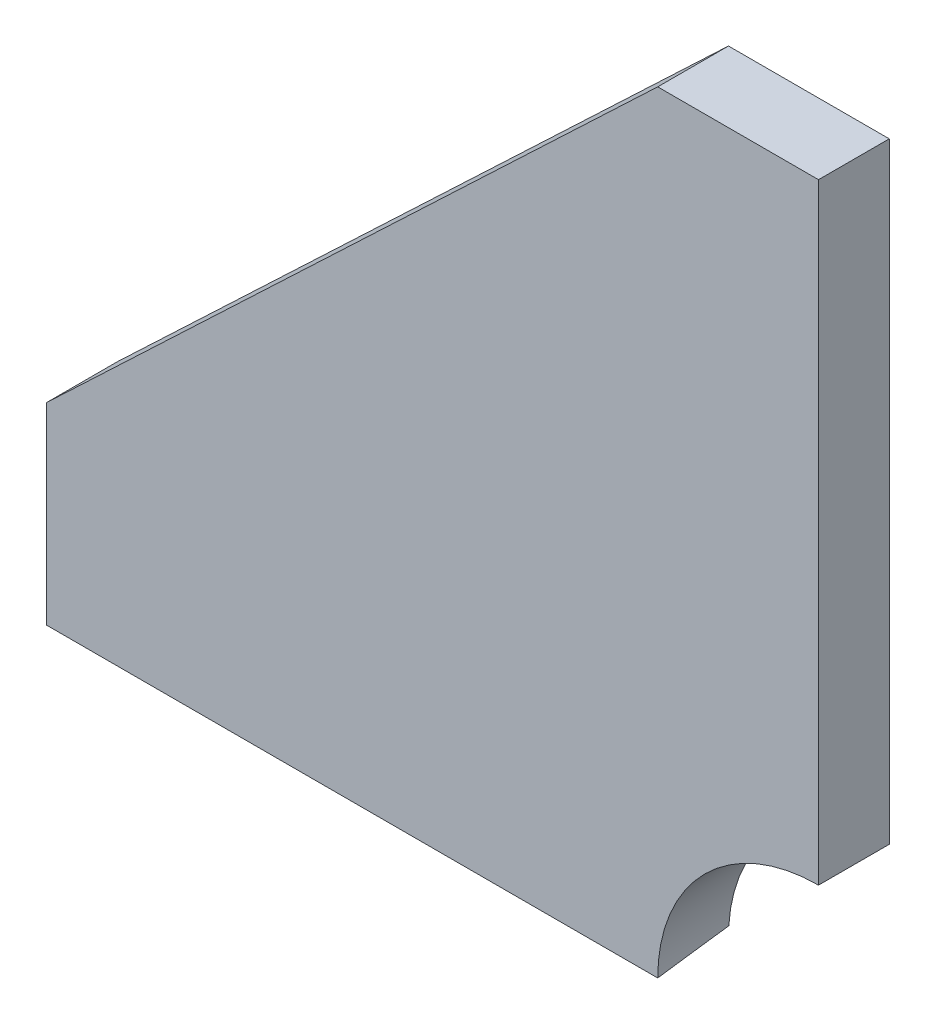
ISO-10303-21;
HEADER;
FILE_DESCRIPTION(('STEP AP214'),'2;1');
FILE_NAME('part.step','',(''),(''),'','','');
FILE_SCHEMA(('AUTOMOTIVE_DESIGN { 1 0 10303 214 1 1 1 1 }'));
ENDSEC;
DATA;
#1=APPLICATION_CONTEXT('core data for automotive mechanical design processes');
#2=APPLICATION_PROTOCOL_DEFINITION('international standard','automotive_design',2000,#1);
#3=PRODUCT_CONTEXT('',#1,'mechanical');
#4=PRODUCT('Part','Part','',(#3));
#5=PRODUCT_RELATED_PRODUCT_CATEGORY('part','',(#4));
#6=PRODUCT_DEFINITION_FORMATION('','',#4);
#7=PRODUCT_DEFINITION_CONTEXT('part definition',#1,'design');
#8=PRODUCT_DEFINITION('design','',#6,#7);
#9=PRODUCT_DEFINITION_SHAPE('','',#8);
#10=(LENGTH_UNIT() NAMED_UNIT(*) SI_UNIT(.MILLI.,.METRE.));
#11=(NAMED_UNIT(*) PLANE_ANGLE_UNIT() SI_UNIT($,.RADIAN.));
#12=(NAMED_UNIT(*) SI_UNIT($,.STERADIAN.) SOLID_ANGLE_UNIT());
#13=UNCERTAINTY_MEASURE_WITH_UNIT(LENGTH_MEASURE(1.E-05),#10,'distance_accuracy_value','');
#14=(GEOMETRIC_REPRESENTATION_CONTEXT(3) GLOBAL_UNCERTAINTY_ASSIGNED_CONTEXT((#13)) GLOBAL_UNIT_ASSIGNED_CONTEXT((#10,
#11,#12)) REPRESENTATION_CONTEXT('',''));
#15=CARTESIAN_POINT('',(0.,0.,0.));
#16=DIRECTION('',(0.,0.,1.));
#17=DIRECTION('',(1.,0.,0.));
#18=AXIS2_PLACEMENT_3D('',#15,#16,#17);
#19=CARTESIAN_POINT('',(25.,-120.,11.));
#20=DIRECTION('',(0.,0.,-1.));
#21=DIRECTION('',(-1.,0.,0.));
#22=AXIS2_PLACEMENT_3D('',#19,#20,#21);
#23=CYLINDRICAL_SURFACE('',#22,25.);
#24=CARTESIAN_POINT('',(25.,-120.,11.));
#25=DIRECTION('',(0.,0.990268068741571,0.139173100960059));
#26=DIRECTION('',(0.,0.139173100960059,-0.990268068741571));
#27=AXIS2_PLACEMENT_3D('',#24,#25,#26);
#28=ELLIPSE('',#27,179.632413358201,25.);
#29=CARTESIAN_POINT('',(0.0478449602540551,-118.454050818274,0.));
#30=VERTEX_POINT('',#29);
#31=CARTESIAN_POINT('',(0.,-120.,11.));
#32=VERTEX_POINT('',#31);
#33=EDGE_CURVE('E110',#30,#32,#28,.T.);
#34=ORIENTED_EDGE('',*,*,#33,.F.);
#35=CARTESIAN_POINT('',(25.,-120.,0.));
#36=DIRECTION('',(0.,0.,1.));
#37=DIRECTION('',(1.,0.,0.));
#38=AXIS2_PLACEMENT_3D('',#35,#36,#37);
#39=CIRCLE('',#38,25.);
#40=CARTESIAN_POINT('',(25.,-95.,0.));
#41=VERTEX_POINT('',#40);
#42=EDGE_CURVE('E131',#41,#30,#39,.T.);
#43=ORIENTED_EDGE('',*,*,#42,.F.);
#44=DIRECTION('',(0.,0.,-1.));
#45=VECTOR('',#44,1.);
#46=CARTESIAN_POINT('',(25.,-95.,11.));
#47=LINE('',#46,#45);
#48=CARTESIAN_POINT('',(25.,-95.,11.));
#49=VERTEX_POINT('',#48);
#50=EDGE_CURVE('E55',#49,#41,#47,.T.);
#51=ORIENTED_EDGE('',*,*,#50,.F.);
#52=CARTESIAN_POINT('',(25.,-120.,11.));
#53=DIRECTION('',(0.,0.,1.));
#54=DIRECTION('',(1.,0.,0.));
#55=AXIS2_PLACEMENT_3D('',#52,#53,#54);
#56=CIRCLE('',#55,25.);
#57=EDGE_CURVE('E147',#49,#32,#56,.T.);
#58=ORIENTED_EDGE('',*,*,#57,.T.);
#59=EDGE_LOOP('',(#34,#43,#51,#58));
#60=FACE_BOUND('',#59,.T.);
#61=ADVANCED_FACE('F47',(#60),#23,.F.);
#62=CARTESIAN_POINT('',(25.,0.,11.));
#63=DIRECTION('',(1.,0.,0.));
#64=DIRECTION('',(0.,1.,0.));
#65=AXIS2_PLACEMENT_3D('',#62,#63,#64);
#66=PLANE('',#65);
#67=DIRECTION('',(0.,-1.,0.));
#68=VECTOR('',#67,1.);
#69=CARTESIAN_POINT('',(25.,0.,0.));
#70=LINE('',#69,#68);
#71=CARTESIAN_POINT('',(25.,0.,0.));
#72=VERTEX_POINT('',#71);
#73=EDGE_CURVE('E135',#72,#41,#70,.T.);
#74=ORIENTED_EDGE('',*,*,#73,.F.);
#75=DIRECTION('',(0.,0.,-1.));
#76=VECTOR('',#75,1.);
#77=CARTESIAN_POINT('',(25.,0.,11.));
#78=LINE('',#77,#76);
#79=CARTESIAN_POINT('',(25.,0.,11.));
#80=VERTEX_POINT('',#79);
#81=EDGE_CURVE('E153',#80,#72,#78,.T.);
#82=ORIENTED_EDGE('',*,*,#81,.F.);
#83=DIRECTION('',(0.,-1.,0.));
#84=VECTOR('',#83,1.);
#85=CARTESIAN_POINT('',(25.,0.,11.));
#86=LINE('',#85,#84);
#87=EDGE_CURVE('E161',#80,#49,#86,.T.);
#88=ORIENTED_EDGE('',*,*,#87,.T.);
#89=ORIENTED_EDGE('',*,*,#50,.T.);
#90=EDGE_LOOP('',(#74,#82,#88,#89));
#91=FACE_BOUND('',#90,.T.);
#92=ADVANCED_FACE('F159',(#91),#66,.T.);
#93=CARTESIAN_POINT('',(0.,0.,11.));
#94=DIRECTION('',(0.,1.,0.));
#95=DIRECTION('',(0.,0.,1.));
#96=AXIS2_PLACEMENT_3D('',#93,#94,#95);
#97=PLANE('',#96);
#98=DIRECTION('',(1.,0.,0.));
#99=VECTOR('',#98,1.);
#100=CARTESIAN_POINT('',(0.,0.,0.));
#101=LINE('',#100,#99);
#102=CARTESIAN_POINT('',(0.,0.,0.));
#103=VERTEX_POINT('',#102);
#104=EDGE_CURVE('E139',#103,#72,#101,.T.);
#105=ORIENTED_EDGE('',*,*,#104,.F.);
#106=DIRECTION('',(0.,0.,-1.));
#107=VECTOR('',#106,1.);
#108=CARTESIAN_POINT('',(0.,0.,11.));
#109=LINE('',#108,#107);
#110=CARTESIAN_POINT('',(0.,0.,11.));
#111=VERTEX_POINT('',#110);
#112=EDGE_CURVE('E150',#111,#103,#109,.T.);
#113=ORIENTED_EDGE('',*,*,#112,.F.);
#114=DIRECTION('',(1.,0.,0.));
#115=VECTOR('',#114,1.);
#116=CARTESIAN_POINT('',(0.,0.,11.));
#117=LINE('',#116,#115);
#118=EDGE_CURVE('E127',#111,#80,#117,.T.);
#119=ORIENTED_EDGE('',*,*,#118,.T.);
#120=ORIENTED_EDGE('',*,*,#81,.T.);
#121=EDGE_LOOP('',(#105,#113,#119,#120));
#122=FACE_BOUND('',#121,.T.);
#123=ADVANCED_FACE('F166',(#122),#97,.T.);
#124=CARTESIAN_POINT('',(0.,0.,11.));
#125=DIRECTION('',(0.687744647910783,-0.725952683905827,0.));
#126=DIRECTION('',(0.725952683905827,0.687744647910783,0.));
#127=AXIS2_PLACEMENT_3D('',#124,#125,#126);
#128=PLANE('',#127);
#129=DIRECTION('',(-0.725952683905827,-0.687744647910783,0.));
#130=VECTOR('',#129,1.);
#131=CARTESIAN_POINT('',(0.,0.,0.));
#132=LINE('',#131,#130);
#133=CARTESIAN_POINT('',(-95.,-90.,0.));
#134=VERTEX_POINT('',#133);
#135=EDGE_CURVE('E91',#103,#134,#132,.T.);
#136=ORIENTED_EDGE('',*,*,#135,.T.);
#137=DIRECTION('',(0.,0.,-1.));
#138=VECTOR('',#137,1.);
#139=CARTESIAN_POINT('',(-95.,-90.,11.));
#140=LINE('',#139,#138);
#141=CARTESIAN_POINT('',(-95.,-90.,11.));
#142=VERTEX_POINT('',#141);
#143=EDGE_CURVE('E112',#142,#134,#140,.T.);
#144=ORIENTED_EDGE('',*,*,#143,.F.);
#145=DIRECTION('',(-0.725952683905827,-0.687744647910783,0.));
#146=VECTOR('',#145,1.);
#147=CARTESIAN_POINT('',(0.,0.,11.));
#148=LINE('',#147,#146);
#149=EDGE_CURVE('E70',#111,#142,#148,.T.);
#150=ORIENTED_EDGE('',*,*,#149,.F.);
#151=ORIENTED_EDGE('',*,*,#112,.T.);
#152=EDGE_LOOP('',(#136,#144,#150,#151));
#153=FACE_BOUND('',#152,.T.);
#154=ADVANCED_FACE('F175',(#153),#128,.F.);
#155=CARTESIAN_POINT('',(-95.,0.,11.));
#156=DIRECTION('',(1.,0.,0.));
#157=DIRECTION('',(0.,0.,-1.));
#158=AXIS2_PLACEMENT_3D('',#155,#156,#157);
#159=PLANE('',#158);
#160=DIRECTION('',(0.,-1.,0.));
#161=VECTOR('',#160,1.);
#162=CARTESIAN_POINT('',(-95.,0.,0.));
#163=LINE('',#162,#161);
#164=CARTESIAN_POINT('',(-95.,-118.454050818274,0.));
#165=VERTEX_POINT('',#164);
#166=EDGE_CURVE('E120',#134,#165,#163,.T.);
#167=ORIENTED_EDGE('',*,*,#166,.T.);
#168=DIRECTION('',(0.,0.139173100960059,-0.990268068741571));
#169=VECTOR('',#168,1.);
#170=CARTESIAN_POINT('',(-95.,-118.454050818274,0.));
#171=LINE('',#170,#169);
#172=CARTESIAN_POINT('',(-95.,-120.,11.));
#173=VERTEX_POINT('',#172);
#174=EDGE_CURVE('E62',#173,#165,#171,.T.);
#175=ORIENTED_EDGE('',*,*,#174,.F.);
#176=DIRECTION('',(0.,-1.,0.));
#177=VECTOR('',#176,1.);
#178=CARTESIAN_POINT('',(-95.,0.,11.));
#179=LINE('',#178,#177);
#180=EDGE_CURVE('E113',#142,#173,#179,.T.);
#181=ORIENTED_EDGE('',*,*,#180,.F.);
#182=ORIENTED_EDGE('',*,*,#143,.T.);
#183=EDGE_LOOP('',(#167,#175,#181,#182));
#184=FACE_BOUND('',#183,.T.);
#185=ADVANCED_FACE('F118',(#184),#159,.F.);
#186=CARTESIAN_POINT('',(0.,0.,11.));
#187=DIRECTION('',(0.,0.,1.));
#188=DIRECTION('',(1.,0.,0.));
#189=AXIS2_PLACEMENT_3D('',#186,#187,#188);
#190=PLANE('',#189);
#191=ORIENTED_EDGE('',*,*,#57,.F.);
#192=ORIENTED_EDGE('',*,*,#87,.F.);
#193=ORIENTED_EDGE('',*,*,#118,.F.);
#194=ORIENTED_EDGE('',*,*,#149,.T.);
#195=ORIENTED_EDGE('',*,*,#180,.T.);
#196=DIRECTION('',(1.,0.,0.));
#197=VECTOR('',#196,1.);
#198=CARTESIAN_POINT('',(0.,-120.,11.));
#199=LINE('',#198,#197);
#200=EDGE_CURVE('E107',#173,#32,#199,.T.);
#201=ORIENTED_EDGE('',*,*,#200,.T.);
#202=EDGE_LOOP('',(#191,#192,#193,#194,#195,#201));
#203=FACE_BOUND('',#202,.T.);
#204=ADVANCED_FACE('F123',(#203),#190,.T.);
#205=CARTESIAN_POINT('',(0.,0.,0.));
#206=DIRECTION('',(0.,0.,1.));
#207=DIRECTION('',(1.,0.,0.));
#208=AXIS2_PLACEMENT_3D('',#205,#206,#207);
#209=PLANE('',#208);
#210=ORIENTED_EDGE('',*,*,#42,.T.);
#211=DIRECTION('',(-1.,0.,0.));
#212=VECTOR('',#211,1.);
#213=CARTESIAN_POINT('',(0.,-118.454050818274,0.));
#214=LINE('',#213,#212);
#215=EDGE_CURVE('E11',#30,#165,#214,.T.);
#216=ORIENTED_EDGE('',*,*,#215,.T.);
#217=ORIENTED_EDGE('',*,*,#166,.F.);
#218=ORIENTED_EDGE('',*,*,#135,.F.);
#219=ORIENTED_EDGE('',*,*,#104,.T.);
#220=ORIENTED_EDGE('',*,*,#73,.T.);
#221=EDGE_LOOP('',(#210,#216,#217,#218,#219,#220));
#222=FACE_BOUND('',#221,.T.);
#223=ADVANCED_FACE('F163',(#222),#209,.F.);
#224=CARTESIAN_POINT('',(19.,-118.454050818274,0.));
#225=DIRECTION('',(0.,0.990268068741571,0.139173100960059));
#226=DIRECTION('',(0.,-0.139173100960059,0.990268068741571));
#227=AXIS2_PLACEMENT_3D('',#224,#225,#226);
#228=PLANE('',#227);
#229=ORIENTED_EDGE('',*,*,#33,.T.);
#230=ORIENTED_EDGE('',*,*,#200,.F.);
#231=ORIENTED_EDGE('',*,*,#174,.T.);
#232=ORIENTED_EDGE('',*,*,#215,.F.);
#233=EDGE_LOOP('',(#229,#230,#231,#232));
#234=FACE_BOUND('',#233,.T.);
#235=ADVANCED_FACE('F108',(#234),#228,.F.);
#236=CLOSED_SHELL('',(#61,#92,#123,#154,#185,#204,#223,#235));
#237=MANIFOLD_SOLID_BREP('B2',#236);
#238=ADVANCED_BREP_SHAPE_REPRESENTATION('',(#18,#237),#14);
#239=SHAPE_DEFINITION_REPRESENTATION(#9,#238);
ENDSEC;
END-ISO-10303-21;
